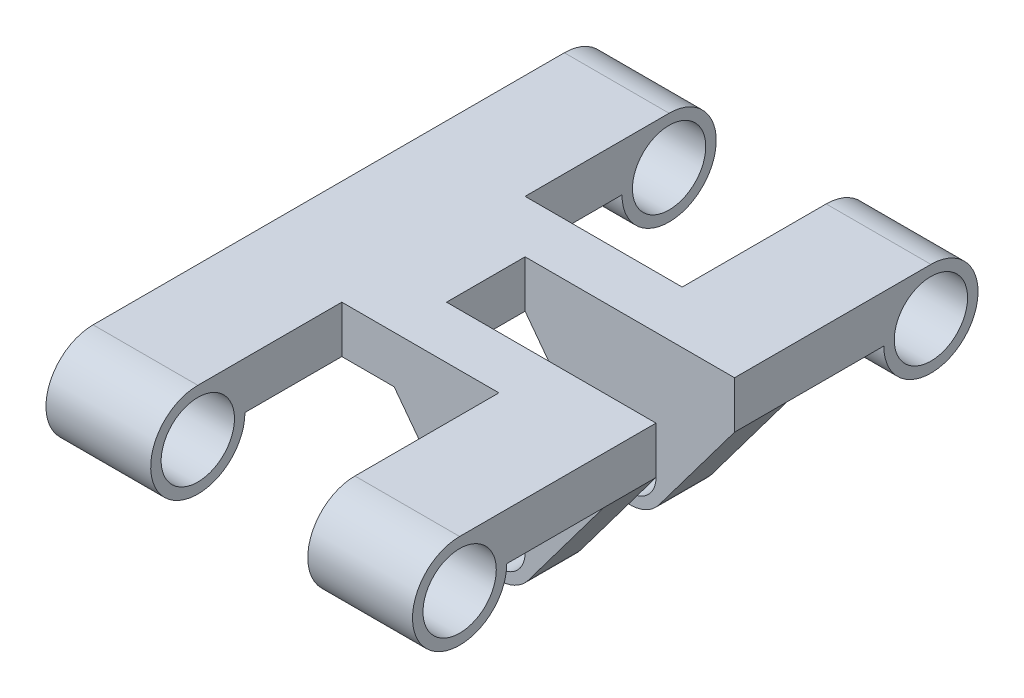
ISO-10303-21;
HEADER;
FILE_DESCRIPTION(('STEP AP214'),'2;1');
FILE_NAME('part.step','',(''),(''),'','','');
FILE_SCHEMA(('AUTOMOTIVE_DESIGN { 1 0 10303 214 1 1 1 1 }'));
ENDSEC;
DATA;
#1=APPLICATION_CONTEXT('core data for automotive mechanical design processes');
#2=APPLICATION_PROTOCOL_DEFINITION('international standard','automotive_design',2000,#1);
#3=PRODUCT_CONTEXT('',#1,'mechanical');
#4=PRODUCT('Part','Part','',(#3));
#5=PRODUCT_RELATED_PRODUCT_CATEGORY('part','',(#4));
#6=PRODUCT_DEFINITION_FORMATION('','',#4);
#7=PRODUCT_DEFINITION_CONTEXT('part definition',#1,'design');
#8=PRODUCT_DEFINITION('design','',#6,#7);
#9=PRODUCT_DEFINITION_SHAPE('','',#8);
#10=(LENGTH_UNIT() NAMED_UNIT(*) SI_UNIT(.MILLI.,.METRE.));
#11=(NAMED_UNIT(*) PLANE_ANGLE_UNIT() SI_UNIT($,.RADIAN.));
#12=(NAMED_UNIT(*) SI_UNIT($,.STERADIAN.) SOLID_ANGLE_UNIT());
#13=UNCERTAINTY_MEASURE_WITH_UNIT(LENGTH_MEASURE(1.E-05),#10,'distance_accuracy_value','');
#14=(GEOMETRIC_REPRESENTATION_CONTEXT(3) GLOBAL_UNCERTAINTY_ASSIGNED_CONTEXT((#13)) GLOBAL_UNIT_ASSIGNED_CONTEXT((#10,
#11,#12)) REPRESENTATION_CONTEXT('',''));
#15=CARTESIAN_POINT('',(0.,0.,0.));
#16=DIRECTION('',(0.,0.,1.));
#17=DIRECTION('',(1.,0.,0.));
#18=AXIS2_PLACEMENT_3D('',#15,#16,#17);
#19=CARTESIAN_POINT('',(-20.,0.,0.));
#20=DIRECTION('',(0.,-1.,0.));
#21=DIRECTION('',(0.,0.,-1.));
#22=AXIS2_PLACEMENT_3D('',#19,#20,#21);
#23=PLANE('',#22);
#24=DIRECTION('',(0.,0.,-1.));
#25=VECTOR('',#24,1.);
#26=CARTESIAN_POINT('',(10.,0.,-52.5));
#27=LINE('',#26,#25);
#28=CARTESIAN_POINT('',(10.,0.,-37.4999999999999));
#29=VERTEX_POINT('',#28);
#30=CARTESIAN_POINT('',(10.,0.,-52.5));
#31=VERTEX_POINT('',#30);
#32=EDGE_CURVE('E257',#29,#31,#27,.T.);
#33=ORIENTED_EDGE('',*,*,#32,.F.);
#34=DIRECTION('',(0.,0.,-1.));
#35=VECTOR('',#34,1.);
#36=CARTESIAN_POINT('',(10.,0.,18.1508488420533));
#37=LINE('',#36,#35);
#38=CARTESIAN_POINT('',(10.,0.,-27.5));
#39=VERTEX_POINT('',#38);
#40=EDGE_CURVE('E384',#39,#29,#37,.T.);
#41=ORIENTED_EDGE('',*,*,#40,.F.);
#42=DIRECTION('',(1.,0.,0.));
#43=VECTOR('',#42,1.);
#44=CARTESIAN_POINT('',(50.,0.,-27.5));
#45=LINE('',#44,#43);
#46=CARTESIAN_POINT('',(0.,0.,-27.5));
#47=VERTEX_POINT('',#46);
#48=EDGE_CURVE('E246',#47,#39,#45,.T.);
#49=ORIENTED_EDGE('',*,*,#48,.F.);
#50=DIRECTION('',(0.,0.,-1.));
#51=VECTOR('',#50,1.);
#52=CARTESIAN_POINT('',(0.,0.,0.));
#53=LINE('',#52,#51);
#54=CARTESIAN_POINT('',(0.,0.,-9.));
#55=VERTEX_POINT('',#54);
#56=EDGE_CURVE('E304',#55,#47,#53,.T.);
#57=ORIENTED_EDGE('',*,*,#56,.F.);
#58=DIRECTION('',(1.,0.,0.));
#59=VECTOR('',#58,1.);
#60=CARTESIAN_POINT('',(-20.,0.,-9.));
#61=LINE('',#60,#59);
#62=CARTESIAN_POINT('',(-20.,0.,-9.));
#63=VERTEX_POINT('',#62);
#64=EDGE_CURVE('E64',#63,#55,#61,.T.);
#65=ORIENTED_EDGE('',*,*,#64,.F.);
#66=DIRECTION('',(0.,0.,-1.));
#67=VECTOR('',#66,1.);
#68=CARTESIAN_POINT('',(-20.,0.,0.));
#69=LINE('',#68,#67);
#70=CARTESIAN_POINT('',(-20.,0.,-81.));
#71=VERTEX_POINT('',#70);
#72=EDGE_CURVE('E279',#63,#71,#69,.T.);
#73=ORIENTED_EDGE('',*,*,#72,.T.);
#74=DIRECTION('',(1.,0.,0.));
#75=VECTOR('',#74,1.);
#76=CARTESIAN_POINT('',(-20.,0.,-81.));
#77=LINE('',#76,#75);
#78=CARTESIAN_POINT('',(0.,0.,-81.));
#79=VERTEX_POINT('',#78);
#80=EDGE_CURVE('E303',#71,#79,#77,.T.);
#81=ORIENTED_EDGE('',*,*,#80,.T.);
#82=CARTESIAN_POINT('',(0.,0.,-62.5));
#83=VERTEX_POINT('',#82);
#84=EDGE_CURVE('E278',#83,#79,#53,.T.);
#85=ORIENTED_EDGE('',*,*,#84,.F.);
#86=DIRECTION('',(-1.,0.,0.));
#87=VECTOR('',#86,1.);
#88=CARTESIAN_POINT('',(0.,0.,-62.5));
#89=LINE('',#88,#87);
#90=CARTESIAN_POINT('',(10.,0.,-62.5));
#91=VERTEX_POINT('',#90);
#92=EDGE_CURVE('E264',#91,#83,#89,.T.);
#93=ORIENTED_EDGE('',*,*,#92,.F.);
#94=DIRECTION('',(0.,0.,1.));
#95=VECTOR('',#94,1.);
#96=CARTESIAN_POINT('',(10.,0.,-108.150848842053));
#97=LINE('',#96,#95);
#98=EDGE_CURVE('E386',#91,#31,#97,.T.);
#99=ORIENTED_EDGE('',*,*,#98,.T.);
#100=EDGE_LOOP('',(#33,#41,#49,#57,#65,#73,#81,#85,#93,#99));
#101=FACE_BOUND('',#100,.T.);
#102=ADVANCED_FACE('F55',(#101),#23,.T.);
#103=DIRECTION('',(-1.,0.,0.));
#104=VECTOR('',#103,1.);
#105=CARTESIAN_POINT('',(10.,0.,-27.5));
#106=LINE('',#105,#104);
#107=CARTESIAN_POINT('',(50.,0.,-27.5));
#108=VERTEX_POINT('',#107);
#109=CARTESIAN_POINT('',(29.9999999999999,0.,-27.5));
#110=VERTEX_POINT('',#109);
#111=EDGE_CURVE('E222',#108,#110,#106,.T.);
#112=ORIENTED_EDGE('',*,*,#111,.F.);
#113=DIRECTION('',(0.,0.,-1.));
#114=VECTOR('',#113,1.);
#115=CARTESIAN_POINT('',(50.,0.,-37.5));
#116=LINE('',#115,#114);
#117=CARTESIAN_POINT('',(50.,0.,-9.00000000000004));
#118=VERTEX_POINT('',#117);
#119=EDGE_CURVE('E231',#118,#108,#116,.T.);
#120=ORIENTED_EDGE('',*,*,#119,.F.);
#121=DIRECTION('',(1.,0.,0.));
#122=VECTOR('',#121,1.);
#123=CARTESIAN_POINT('',(30.,0.,-8.99999999999999));
#124=LINE('',#123,#122);
#125=CARTESIAN_POINT('',(30.,0.,-8.99999999999999));
#126=VERTEX_POINT('',#125);
#127=EDGE_CURVE('E431',#126,#118,#124,.T.);
#128=ORIENTED_EDGE('',*,*,#127,.F.);
#129=DIRECTION('',(0.,0.,-1.));
#130=VECTOR('',#129,1.);
#131=CARTESIAN_POINT('',(30.,0.,0.));
#132=LINE('',#131,#130);
#133=EDGE_CURVE('E234',#126,#110,#132,.T.);
#134=ORIENTED_EDGE('',*,*,#133,.T.);
#135=EDGE_LOOP('',(#112,#120,#128,#134));
#136=FACE_BOUND('',#135,.T.);
#137=ADVANCED_FACE('F230',(#136),#23,.T.);
#138=CARTESIAN_POINT('',(0.,-61.0327780786685,-62.5));
#139=DIRECTION('',(0.,0.,-1.));
#140=DIRECTION('',(-1.,0.,0.));
#141=AXIS2_PLACEMENT_3D('',#138,#139,#140);
#142=PLANE('',#141);
#143=DIRECTION('',(-1.,0.,0.));
#144=VECTOR('',#143,1.);
#145=CARTESIAN_POINT('',(0.,9.,-62.5));
#146=LINE('',#145,#144);
#147=CARTESIAN_POINT('',(29.9999999999998,9.,-62.5));
#148=VERTEX_POINT('',#147);
#149=CARTESIAN_POINT('',(0.,9.,-62.5));
#150=VERTEX_POINT('',#149);
#151=EDGE_CURVE('E253',#148,#150,#146,.T.);
#152=ORIENTED_EDGE('',*,*,#151,.F.);
#153=DIRECTION('',(0.,-1.,0.));
#154=VECTOR('',#153,1.);
#155=CARTESIAN_POINT('',(29.9999999999998,-61.0327780786685,-62.5));
#156=LINE('',#155,#154);
#157=CARTESIAN_POINT('',(29.9999999999998,0.,-62.5));
#158=VERTEX_POINT('',#157);
#159=EDGE_CURVE('E13',#148,#158,#156,.T.);
#160=ORIENTED_EDGE('',*,*,#159,.T.);
#161=DIRECTION('',(-1.,0.,0.));
#162=VECTOR('',#161,1.);
#163=CARTESIAN_POINT('',(10.,0.,-62.5));
#164=LINE('',#163,#162);
#165=CARTESIAN_POINT('',(50.,0.,-62.5));
#166=VERTEX_POINT('',#165);
#167=EDGE_CURVE('E390',#166,#158,#164,.T.);
#168=ORIENTED_EDGE('',*,*,#167,.F.);
#169=DIRECTION('',(0.6,0.8,0.));
#170=VECTOR('',#169,1.);
#171=CARTESIAN_POINT('',(50.,0.,-62.5));
#172=LINE('',#171,#170);
#173=CARTESIAN_POINT('',(35.6,-19.2,-62.5));
#174=VERTEX_POINT('',#173);
#175=EDGE_CURVE('E71',#174,#166,#172,.T.);
#176=ORIENTED_EDGE('',*,*,#175,.F.);
#177=CARTESIAN_POINT('',(30.,-15.,-62.5));
#178=DIRECTION('',(0.,0.,-1.));
#179=DIRECTION('',(-1.,0.,0.));
#180=AXIS2_PLACEMENT_3D('',#177,#178,#179);
#181=CIRCLE('',#180,7.);
#182=CARTESIAN_POINT('',(24.4,-19.2,-62.5));
#183=VERTEX_POINT('',#182);
#184=EDGE_CURVE('E566',#183,#174,#181,.F.);
#185=ORIENTED_EDGE('',*,*,#184,.F.);
#186=DIRECTION('',(0.6,-0.8,0.));
#187=VECTOR('',#186,1.);
#188=CARTESIAN_POINT('',(10.,0.,-62.5));
#189=LINE('',#188,#187);
#190=EDGE_CURVE('E562',#91,#183,#189,.T.);
#191=ORIENTED_EDGE('',*,*,#190,.F.);
#192=ORIENTED_EDGE('',*,*,#92,.T.);
#193=DIRECTION('',(0.,1.,0.));
#194=VECTOR('',#193,1.);
#195=CARTESIAN_POINT('',(0.,-61.0327780786685,-62.5));
#196=LINE('',#195,#194);
#197=EDGE_CURVE('E259',#83,#150,#196,.T.);
#198=ORIENTED_EDGE('',*,*,#197,.T.);
#199=EDGE_LOOP('',(#152,#160,#168,#176,#185,#191,#192,#198));
#200=FACE_BOUND('',#199,.T.);
#201=CARTESIAN_POINT('',(30.,-15.,-62.5));
#202=DIRECTION('',(0.,0.,-1.));
#203=DIRECTION('',(-1.,0.,0.));
#204=AXIS2_PLACEMENT_3D('',#201,#202,#203);
#205=CIRCLE('',#204,4.99999999999999);
#206=CARTESIAN_POINT('',(25.,-15.,-62.5));
#207=VERTEX_POINT('',#206);
#208=EDGE_CURVE('E467',#207,#207,#205,.F.);
#209=ORIENTED_EDGE('',*,*,#208,.T.);
#210=EDGE_LOOP('',(#209));
#211=FACE_BOUND('',#210,.T.);
#212=ADVANCED_FACE('F528',(#200,#211),#142,.T.);
#213=CARTESIAN_POINT('',(50.,-61.0327780786685,-27.5));
#214=DIRECTION('',(0.,0.,1.));
#215=DIRECTION('',(1.,0.,0.));
#216=AXIS2_PLACEMENT_3D('',#213,#214,#215);
#217=PLANE('',#216);
#218=ORIENTED_EDGE('',*,*,#48,.T.);
#219=DIRECTION('',(0.6,-0.8,0.));
#220=VECTOR('',#219,1.);
#221=CARTESIAN_POINT('',(10.,0.,-27.5));
#222=LINE('',#221,#220);
#223=CARTESIAN_POINT('',(24.4,-19.2,-27.5));
#224=VERTEX_POINT('',#223);
#225=EDGE_CURVE('E237',#39,#224,#222,.T.);
#226=ORIENTED_EDGE('',*,*,#225,.T.);
#227=CARTESIAN_POINT('',(30.,-15.,-27.5));
#228=DIRECTION('',(0.,0.,1.));
#229=DIRECTION('',(1.,0.,0.));
#230=AXIS2_PLACEMENT_3D('',#227,#228,#229);
#231=CIRCLE('',#230,7.);
#232=CARTESIAN_POINT('',(35.6,-19.2,-27.5));
#233=VERTEX_POINT('',#232);
#234=EDGE_CURVE('E224',#224,#233,#231,.T.);
#235=ORIENTED_EDGE('',*,*,#234,.T.);
#236=DIRECTION('',(0.6,0.8,0.));
#237=VECTOR('',#236,1.);
#238=CARTESIAN_POINT('',(50.,0.,-27.5));
#239=LINE('',#238,#237);
#240=EDGE_CURVE('E208',#233,#108,#239,.T.);
#241=ORIENTED_EDGE('',*,*,#240,.T.);
#242=ORIENTED_EDGE('',*,*,#111,.T.);
#243=DIRECTION('',(0.,-1.,0.));
#244=VECTOR('',#243,1.);
#245=CARTESIAN_POINT('',(29.9999999999999,0.,-27.4999999999999));
#246=LINE('',#245,#244);
#247=CARTESIAN_POINT('',(29.9999999999999,9.,-27.5));
#248=VERTEX_POINT('',#247);
#249=EDGE_CURVE('E79',#248,#110,#246,.T.);
#250=ORIENTED_EDGE('',*,*,#249,.F.);
#251=DIRECTION('',(1.,0.,0.));
#252=VECTOR('',#251,1.);
#253=CARTESIAN_POINT('',(50.,9.,-27.5));
#254=LINE('',#253,#252);
#255=CARTESIAN_POINT('',(0.,9.,-27.5));
#256=VERTEX_POINT('',#255);
#257=EDGE_CURVE('E423',#256,#248,#254,.T.);
#258=ORIENTED_EDGE('',*,*,#257,.F.);
#259=DIRECTION('',(0.,1.,0.));
#260=VECTOR('',#259,1.);
#261=CARTESIAN_POINT('',(0.,-61.0327780786685,-27.5));
#262=LINE('',#261,#260);
#263=EDGE_CURVE('E263',#47,#256,#262,.T.);
#264=ORIENTED_EDGE('',*,*,#263,.F.);
#265=EDGE_LOOP('',(#218,#226,#235,#241,#242,#250,#258,#264));
#266=FACE_BOUND('',#265,.T.);
#267=CARTESIAN_POINT('',(30.,-15.,-27.5));
#268=DIRECTION('',(0.,0.,1.));
#269=DIRECTION('',(1.,0.,0.));
#270=AXIS2_PLACEMENT_3D('',#267,#268,#269);
#271=CIRCLE('',#270,4.99999999999999);
#272=CARTESIAN_POINT('',(35.,-15.,-27.5));
#273=VERTEX_POINT('',#272);
#274=EDGE_CURVE('E226',#273,#273,#271,.T.);
#275=ORIENTED_EDGE('',*,*,#274,.F.);
#276=EDGE_LOOP('',(#275));
#277=FACE_BOUND('',#276,.T.);
#278=ADVANCED_FACE('F220',(#266,#277),#217,.T.);
#279=CARTESIAN_POINT('',(0.,0.,0.));
#280=DIRECTION('',(1.,0.,0.));
#281=DIRECTION('',(0.,0.,-1.));
#282=AXIS2_PLACEMENT_3D('',#279,#280,#281);
#283=PLANE('',#282);
#284=CARTESIAN_POINT('',(0.,0.,0.));
#285=DIRECTION('',(1.,0.,0.));
#286=DIRECTION('',(0.,0.,-1.));
#287=AXIS2_PLACEMENT_3D('',#284,#285,#286);
#288=CIRCLE('',#287,7.);
#289=CARTESIAN_POINT('',(0.,0.,-7.));
#290=VERTEX_POINT('',#289);
#291=EDGE_CURVE('E321',#290,#290,#288,.T.);
#292=ORIENTED_EDGE('',*,*,#291,.F.);
#293=EDGE_LOOP('',(#292));
#294=FACE_BOUND('',#293,.T.);
#295=ORIENTED_EDGE('',*,*,#56,.T.);
#296=ORIENTED_EDGE('',*,*,#263,.T.);
#297=DIRECTION('',(0.,0.,-1.));
#298=VECTOR('',#297,1.);
#299=CARTESIAN_POINT('',(0.,9.,0.));
#300=LINE('',#299,#298);
#301=CARTESIAN_POINT('',(0.,9.,0.));
#302=VERTEX_POINT('',#301);
#303=EDGE_CURVE('E313',#302,#256,#300,.T.);
#304=ORIENTED_EDGE('',*,*,#303,.F.);
#305=CARTESIAN_POINT('',(0.,0.,0.));
#306=DIRECTION('',(1.,0.,0.));
#307=DIRECTION('',(0.,0.,-1.));
#308=AXIS2_PLACEMENT_3D('',#305,#306,#307);
#309=CIRCLE('',#308,9.);
#310=EDGE_CURVE('E317',#302,#55,#309,.T.);
#311=ORIENTED_EDGE('',*,*,#310,.T.);
#312=EDGE_LOOP('',(#295,#296,#304,#311));
#313=FACE_BOUND('',#312,.T.);
#314=ADVANCED_FACE('F522',(#294,#313),#283,.T.);
#315=ORIENTED_EDGE('',*,*,#167,.T.);
#316=DIRECTION('',(0.,0.,-1.));
#317=VECTOR('',#316,1.);
#318=CARTESIAN_POINT('',(30.,0.,0.));
#319=LINE('',#318,#317);
#320=CARTESIAN_POINT('',(29.9999999999998,0.,-81.0000000000001));
#321=VERTEX_POINT('',#320);
#322=EDGE_CURVE('E473',#158,#321,#319,.T.);
#323=ORIENTED_EDGE('',*,*,#322,.T.);
#324=DIRECTION('',(1.,0.,0.));
#325=VECTOR('',#324,1.);
#326=CARTESIAN_POINT('',(29.9999999999998,0.,-81.0000000000001));
#327=LINE('',#326,#325);
#328=CARTESIAN_POINT('',(49.9999999999998,0.,-81.0000000000001));
#329=VERTEX_POINT('',#328);
#330=EDGE_CURVE('E459',#321,#329,#327,.T.);
#331=ORIENTED_EDGE('',*,*,#330,.T.);
#332=DIRECTION('',(0.,0.,-1.));
#333=VECTOR('',#332,1.);
#334=CARTESIAN_POINT('',(50.,0.,-62.5));
#335=LINE('',#334,#333);
#336=EDGE_CURVE('E269',#166,#329,#335,.T.);
#337=ORIENTED_EDGE('',*,*,#336,.F.);
#338=EDGE_LOOP('',(#315,#323,#331,#337));
#339=FACE_BOUND('',#338,.T.);
#340=ADVANCED_FACE('F57',(#339),#23,.T.);
#341=CARTESIAN_POINT('',(-20.,0.,0.));
#342=DIRECTION('',(1.,0.,0.));
#343=DIRECTION('',(0.,0.,-1.));
#344=AXIS2_PLACEMENT_3D('',#341,#342,#343);
#345=CYLINDRICAL_SURFACE('',#344,9.);
#346=ORIENTED_EDGE('',*,*,#310,.F.);
#347=DIRECTION('',(1.,0.,0.));
#348=VECTOR('',#347,1.);
#349=CARTESIAN_POINT('',(-20.,9.,0.));
#350=LINE('',#349,#348);
#351=CARTESIAN_POINT('',(-20.,9.,0.));
#352=VERTEX_POINT('',#351);
#353=EDGE_CURVE('E330',#352,#302,#350,.T.);
#354=ORIENTED_EDGE('',*,*,#353,.F.);
#355=CARTESIAN_POINT('',(-20.,0.,0.));
#356=DIRECTION('',(1.,0.,0.));
#357=DIRECTION('',(0.,0.,-1.));
#358=AXIS2_PLACEMENT_3D('',#355,#356,#357);
#359=CIRCLE('',#358,9.);
#360=EDGE_CURVE('E291',#352,#63,#359,.T.);
#361=ORIENTED_EDGE('',*,*,#360,.T.);
#362=ORIENTED_EDGE('',*,*,#64,.T.);
#363=EDGE_LOOP('',(#346,#354,#361,#362));
#364=FACE_BOUND('',#363,.T.);
#365=ADVANCED_FACE('F530',(#364),#345,.T.);
#366=CARTESIAN_POINT('',(-20.,9.,0.));
#367=DIRECTION('',(0.,-1.,0.));
#368=DIRECTION('',(0.,0.,-1.));
#369=AXIS2_PLACEMENT_3D('',#366,#367,#368);
#370=PLANE('',#369);
#371=DIRECTION('',(0.,0.,-1.));
#372=VECTOR('',#371,1.);
#373=CARTESIAN_POINT('',(50.,9.,-62.5));
#374=LINE('',#373,#372);
#375=CARTESIAN_POINT('',(50.,9.,-52.5));
#376=VERTEX_POINT('',#375);
#377=CARTESIAN_POINT('',(49.9999999999998,9.,-90.));
#378=VERTEX_POINT('',#377);
#379=EDGE_CURVE('E405',#376,#378,#374,.T.);
#380=ORIENTED_EDGE('',*,*,#379,.T.);
#381=DIRECTION('',(1.,0.,0.));
#382=VECTOR('',#381,1.);
#383=CARTESIAN_POINT('',(29.9999999999998,9.,-89.9999999999999));
#384=LINE('',#383,#382);
#385=CARTESIAN_POINT('',(29.9999999999998,9.,-89.9999999999999));
#386=VERTEX_POINT('',#385);
#387=EDGE_CURVE('E446',#386,#378,#384,.T.);
#388=ORIENTED_EDGE('',*,*,#387,.F.);
#389=DIRECTION('',(0.,0.,-1.));
#390=VECTOR('',#389,1.);
#391=CARTESIAN_POINT('',(30.,9.,0.));
#392=LINE('',#391,#390);
#393=EDGE_CURVE('E550',#148,#386,#392,.T.);
#394=ORIENTED_EDGE('',*,*,#393,.F.);
#395=ORIENTED_EDGE('',*,*,#151,.T.);
#396=CARTESIAN_POINT('',(0.,9.,-90.));
#397=VERTEX_POINT('',#396);
#398=EDGE_CURVE('E312',#150,#397,#300,.T.);
#399=ORIENTED_EDGE('',*,*,#398,.T.);
#400=DIRECTION('',(1.,0.,0.));
#401=VECTOR('',#400,1.);
#402=CARTESIAN_POINT('',(-20.,9.,-90.));
#403=LINE('',#402,#401);
#404=CARTESIAN_POINT('',(-20.,9.,-90.));
#405=VERTEX_POINT('',#404);
#406=EDGE_CURVE('E333',#405,#397,#403,.T.);
#407=ORIENTED_EDGE('',*,*,#406,.F.);
#408=DIRECTION('',(0.,0.,-1.));
#409=VECTOR('',#408,1.);
#410=CARTESIAN_POINT('',(-20.,9.,0.));
#411=LINE('',#410,#409);
#412=EDGE_CURVE('E288',#352,#405,#411,.T.);
#413=ORIENTED_EDGE('',*,*,#412,.F.);
#414=ORIENTED_EDGE('',*,*,#353,.T.);
#415=ORIENTED_EDGE('',*,*,#303,.T.);
#416=ORIENTED_EDGE('',*,*,#257,.T.);
#417=DIRECTION('',(0.,0.,-1.));
#418=VECTOR('',#417,1.);
#419=CARTESIAN_POINT('',(30.,9.,0.));
#420=LINE('',#419,#418);
#421=CARTESIAN_POINT('',(30.,9.,0.));
#422=VERTEX_POINT('',#421);
#423=EDGE_CURVE('E435',#422,#248,#420,.T.);
#424=ORIENTED_EDGE('',*,*,#423,.F.);
#425=DIRECTION('',(1.,0.,0.));
#426=VECTOR('',#425,1.);
#427=CARTESIAN_POINT('',(30.,9.,0.));
#428=LINE('',#427,#426);
#429=CARTESIAN_POINT('',(50.,9.,0.));
#430=VERTEX_POINT('',#429);
#431=EDGE_CURVE('E425',#422,#430,#428,.T.);
#432=ORIENTED_EDGE('',*,*,#431,.T.);
#433=DIRECTION('',(0.,0.,-1.));
#434=VECTOR('',#433,1.);
#435=CARTESIAN_POINT('',(50.,9.,-37.5));
#436=LINE('',#435,#434);
#437=CARTESIAN_POINT('',(50.,9.,-37.5));
#438=VERTEX_POINT('',#437);
#439=EDGE_CURVE('E417',#430,#438,#436,.T.);
#440=ORIENTED_EDGE('',*,*,#439,.T.);
#441=DIRECTION('',(-1.,0.,0.));
#442=VECTOR('',#441,1.);
#443=CARTESIAN_POINT('',(10.,9.,-37.4999999999999));
#444=LINE('',#443,#442);
#445=CARTESIAN_POINT('',(10.,9.,-37.4999999999999));
#446=VERTEX_POINT('',#445);
#447=EDGE_CURVE('E412',#438,#446,#444,.T.);
#448=ORIENTED_EDGE('',*,*,#447,.T.);
#449=DIRECTION('',(0.,0.,-1.));
#450=VECTOR('',#449,1.);
#451=CARTESIAN_POINT('',(10.,9.,-52.5));
#452=LINE('',#451,#450);
#453=CARTESIAN_POINT('',(10.,9.,-52.5));
#454=VERTEX_POINT('',#453);
#455=EDGE_CURVE('E406',#446,#454,#452,.T.);
#456=ORIENTED_EDGE('',*,*,#455,.T.);
#457=DIRECTION('',(1.,0.,0.));
#458=VECTOR('',#457,1.);
#459=CARTESIAN_POINT('',(50.,9.,-52.5));
#460=LINE('',#459,#458);
#461=EDGE_CURVE('E398',#454,#376,#460,.T.);
#462=ORIENTED_EDGE('',*,*,#461,.T.);
#463=EDGE_LOOP('',(#380,#388,#394,#395,#399,#407,#413,#414,#415,#416,#424,#432,#440,#448,#456,#462));
#464=FACE_BOUND('',#463,.T.);
#465=ADVANCED_FACE('F409',(#464),#370,.F.);
#466=CARTESIAN_POINT('',(-20.,0.,0.));
#467=DIRECTION('',(1.,0.,0.));
#468=DIRECTION('',(0.,0.,-1.));
#469=AXIS2_PLACEMENT_3D('',#466,#467,#468);
#470=CYLINDRICAL_SURFACE('',#469,7.);
#471=CARTESIAN_POINT('',(-20.,0.,0.));
#472=DIRECTION('',(1.,0.,0.));
#473=DIRECTION('',(0.,0.,-1.));
#474=AXIS2_PLACEMENT_3D('',#471,#472,#473);
#475=CIRCLE('',#474,7.);
#476=CARTESIAN_POINT('',(-20.,0.,-7.));
#477=VERTEX_POINT('',#476);
#478=EDGE_CURVE('E295',#477,#477,#475,.T.);
#479=ORIENTED_EDGE('',*,*,#478,.F.);
#480=EDGE_LOOP('',(#479));
#481=FACE_BOUND('',#480,.T.);
#482=ORIENTED_EDGE('',*,*,#291,.T.);
#483=EDGE_LOOP('',(#482));
#484=FACE_BOUND('',#483,.T.);
#485=ADVANCED_FACE('F663',(#481,#484),#470,.F.);
#486=CARTESIAN_POINT('',(-20.,0.,-90.));
#487=DIRECTION('',(1.,0.,0.));
#488=DIRECTION('',(0.,0.,-1.));
#489=AXIS2_PLACEMENT_3D('',#486,#487,#488);
#490=CYLINDRICAL_SURFACE('',#489,9.);
#491=CARTESIAN_POINT('',(0.,0.,-90.));
#492=DIRECTION('',(1.,0.,0.));
#493=DIRECTION('',(0.,0.,-1.));
#494=AXIS2_PLACEMENT_3D('',#491,#492,#493);
#495=CIRCLE('',#494,9.);
#496=EDGE_CURVE('E308',#79,#397,#495,.T.);
#497=ORIENTED_EDGE('',*,*,#496,.F.);
#498=ORIENTED_EDGE('',*,*,#80,.F.);
#499=CARTESIAN_POINT('',(-20.,0.,-90.));
#500=DIRECTION('',(1.,0.,0.));
#501=DIRECTION('',(0.,0.,-1.));
#502=AXIS2_PLACEMENT_3D('',#499,#500,#501);
#503=CIRCLE('',#502,9.);
#504=EDGE_CURVE('E283',#71,#405,#503,.T.);
#505=ORIENTED_EDGE('',*,*,#504,.T.);
#506=ORIENTED_EDGE('',*,*,#406,.T.);
#507=EDGE_LOOP('',(#497,#498,#505,#506));
#508=FACE_BOUND('',#507,.T.);
#509=ADVANCED_FACE('F347',(#508),#490,.T.);
#510=CARTESIAN_POINT('',(-20.,0.,-90.));
#511=DIRECTION('',(1.,0.,0.));
#512=DIRECTION('',(0.,0.,-1.));
#513=AXIS2_PLACEMENT_3D('',#510,#511,#512);
#514=CYLINDRICAL_SURFACE('',#513,7.);
#515=CARTESIAN_POINT('',(-20.,0.,-90.));
#516=DIRECTION('',(1.,0.,0.));
#517=DIRECTION('',(0.,0.,-1.));
#518=AXIS2_PLACEMENT_3D('',#515,#516,#517);
#519=CIRCLE('',#518,7.);
#520=CARTESIAN_POINT('',(-20.,0.,-97.));
#521=VERTEX_POINT('',#520);
#522=EDGE_CURVE('E299',#521,#521,#519,.T.);
#523=ORIENTED_EDGE('',*,*,#522,.F.);
#524=EDGE_LOOP('',(#523));
#525=FACE_BOUND('',#524,.T.);
#526=CARTESIAN_POINT('',(0.,0.,-90.));
#527=DIRECTION('',(1.,0.,0.));
#528=DIRECTION('',(0.,0.,-1.));
#529=AXIS2_PLACEMENT_3D('',#526,#527,#528);
#530=CIRCLE('',#529,7.);
#531=CARTESIAN_POINT('',(0.,0.,-97.));
#532=VERTEX_POINT('',#531);
#533=EDGE_CURVE('E284',#532,#532,#530,.T.);
#534=ORIENTED_EDGE('',*,*,#533,.T.);
#535=EDGE_LOOP('',(#534));
#536=FACE_BOUND('',#535,.T.);
#537=ADVANCED_FACE('F657',(#525,#536),#514,.F.);
#538=CARTESIAN_POINT('',(-20.,0.,0.));
#539=DIRECTION('',(1.,0.,0.));
#540=DIRECTION('',(0.,0.,-1.));
#541=AXIS2_PLACEMENT_3D('',#538,#539,#540);
#542=PLANE('',#541);
#543=ORIENTED_EDGE('',*,*,#72,.F.);
#544=ORIENTED_EDGE('',*,*,#360,.F.);
#545=ORIENTED_EDGE('',*,*,#412,.T.);
#546=ORIENTED_EDGE('',*,*,#504,.F.);
#547=EDGE_LOOP('',(#543,#544,#545,#546));
#548=FACE_BOUND('',#547,.T.);
#549=ORIENTED_EDGE('',*,*,#478,.T.);
#550=EDGE_LOOP('',(#549));
#551=FACE_BOUND('',#550,.T.);
#552=ORIENTED_EDGE('',*,*,#522,.T.);
#553=EDGE_LOOP('',(#552));
#554=FACE_BOUND('',#553,.T.);
#555=ADVANCED_FACE('F520',(#548,#551,#554),#542,.F.);
#556=ORIENTED_EDGE('',*,*,#197,.F.);
#557=ORIENTED_EDGE('',*,*,#84,.T.);
#558=ORIENTED_EDGE('',*,*,#496,.T.);
#559=ORIENTED_EDGE('',*,*,#398,.F.);
#560=EDGE_LOOP('',(#556,#557,#558,#559));
#561=FACE_BOUND('',#560,.T.);
#562=ORIENTED_EDGE('',*,*,#533,.F.);
#563=EDGE_LOOP('',(#562));
#564=FACE_BOUND('',#563,.T.);
#565=ADVANCED_FACE('F352',(#561,#564),#283,.T.);
#566=CARTESIAN_POINT('',(50.,-61.0327780786685,-37.5));
#567=DIRECTION('',(1.,0.,0.));
#568=DIRECTION('',(0.,0.,-1.));
#569=AXIS2_PLACEMENT_3D('',#566,#567,#568);
#570=PLANE('',#569);
#571=ORIENTED_EDGE('',*,*,#439,.F.);
#572=CARTESIAN_POINT('',(50.,0.,0.));
#573=DIRECTION('',(1.,0.,0.));
#574=DIRECTION('',(0.,0.,-1.));
#575=AXIS2_PLACEMENT_3D('',#572,#573,#574);
#576=CIRCLE('',#575,9.);
#577=EDGE_CURVE('E243',#430,#118,#576,.T.);
#578=ORIENTED_EDGE('',*,*,#577,.T.);
#579=ORIENTED_EDGE('',*,*,#119,.T.);
#580=DIRECTION('',(0.,0.,-1.));
#581=VECTOR('',#580,1.);
#582=CARTESIAN_POINT('',(50.,0.,18.1508488420533));
#583=LINE('',#582,#581);
#584=CARTESIAN_POINT('',(50.,0.,-37.5));
#585=VERTEX_POINT('',#584);
#586=EDGE_CURVE('E205',#108,#585,#583,.T.);
#587=ORIENTED_EDGE('',*,*,#586,.T.);
#588=DIRECTION('',(0.,1.,0.));
#589=VECTOR('',#588,1.);
#590=CARTESIAN_POINT('',(50.,-61.0327780786685,-37.5));
#591=LINE('',#590,#589);
#592=EDGE_CURVE('E245',#585,#438,#591,.T.);
#593=ORIENTED_EDGE('',*,*,#592,.T.);
#594=EDGE_LOOP('',(#571,#578,#579,#587,#593));
#595=FACE_BOUND('',#594,.T.);
#596=CARTESIAN_POINT('',(50.,0.,0.));
#597=DIRECTION('',(1.,0.,0.));
#598=DIRECTION('',(0.,0.,-1.));
#599=AXIS2_PLACEMENT_3D('',#596,#597,#598);
#600=CIRCLE('',#599,7.);
#601=CARTESIAN_POINT('',(50.,0.,-6.99999999999997));
#602=VERTEX_POINT('',#601);
#603=EDGE_CURVE('E458',#602,#602,#600,.T.);
#604=ORIENTED_EDGE('',*,*,#603,.F.);
#605=EDGE_LOOP('',(#604));
#606=FACE_BOUND('',#605,.T.);
#607=ADVANCED_FACE('F240',(#595,#606),#570,.T.);
#608=CARTESIAN_POINT('',(10.,-61.0327780786685,-37.4999999999999));
#609=DIRECTION('',(0.,0.,-1.));
#610=DIRECTION('',(-1.,0.,0.));
#611=AXIS2_PLACEMENT_3D('',#608,#609,#610);
#612=PLANE('',#611);
#613=ORIENTED_EDGE('',*,*,#592,.F.);
#614=DIRECTION('',(0.6,0.8,0.));
#615=VECTOR('',#614,1.);
#616=CARTESIAN_POINT('',(50.,0.,-37.5));
#617=LINE('',#616,#615);
#618=CARTESIAN_POINT('',(35.6,-19.2,-37.5));
#619=VERTEX_POINT('',#618);
#620=EDGE_CURVE('E211',#619,#585,#617,.T.);
#621=ORIENTED_EDGE('',*,*,#620,.F.);
#622=CARTESIAN_POINT('',(30.,-15.,-37.5));
#623=DIRECTION('',(0.,0.,1.));
#624=DIRECTION('',(1.,0.,0.));
#625=AXIS2_PLACEMENT_3D('',#622,#623,#624);
#626=CIRCLE('',#625,7.);
#627=CARTESIAN_POINT('',(24.4,-19.2,-37.5));
#628=VERTEX_POINT('',#627);
#629=EDGE_CURVE('E596',#628,#619,#626,.T.);
#630=ORIENTED_EDGE('',*,*,#629,.F.);
#631=DIRECTION('',(0.6,-0.8,0.));
#632=VECTOR('',#631,1.);
#633=CARTESIAN_POINT('',(10.,0.,-37.5));
#634=LINE('',#633,#632);
#635=EDGE_CURVE('E600',#29,#628,#634,.T.);
#636=ORIENTED_EDGE('',*,*,#635,.F.);
#637=DIRECTION('',(0.,1.,0.));
#638=VECTOR('',#637,1.);
#639=CARTESIAN_POINT('',(10.,-61.0327780786685,-37.4999999999999));
#640=LINE('',#639,#638);
#641=EDGE_CURVE('E251',#29,#446,#640,.T.);
#642=ORIENTED_EDGE('',*,*,#641,.T.);
#643=ORIENTED_EDGE('',*,*,#447,.F.);
#644=EDGE_LOOP('',(#613,#621,#630,#636,#642,#643));
#645=FACE_BOUND('',#644,.T.);
#646=CARTESIAN_POINT('',(30.,-15.,-37.5));
#647=DIRECTION('',(0.,0.,1.));
#648=DIRECTION('',(1.,0.,0.));
#649=AXIS2_PLACEMENT_3D('',#646,#647,#648);
#650=CIRCLE('',#649,4.99999999999999);
#651=CARTESIAN_POINT('',(35.,-15.,-37.5));
#652=VERTEX_POINT('',#651);
#653=EDGE_CURVE('E236',#652,#652,#650,.T.);
#654=ORIENTED_EDGE('',*,*,#653,.T.);
#655=EDGE_LOOP('',(#654));
#656=FACE_BOUND('',#655,.T.);
#657=ADVANCED_FACE('F512',(#645,#656),#612,.T.);
#658=CARTESIAN_POINT('',(10.,-61.0327780786685,-52.5));
#659=DIRECTION('',(1.,0.,0.));
#660=DIRECTION('',(0.,0.,-1.));
#661=AXIS2_PLACEMENT_3D('',#658,#659,#660);
#662=PLANE('',#661);
#663=ORIENTED_EDGE('',*,*,#641,.F.);
#664=ORIENTED_EDGE('',*,*,#32,.T.);
#665=DIRECTION('',(0.,1.,0.));
#666=VECTOR('',#665,1.);
#667=CARTESIAN_POINT('',(10.,-61.0327780786685,-52.5));
#668=LINE('',#667,#666);
#669=EDGE_CURVE('E270',#31,#454,#668,.T.);
#670=ORIENTED_EDGE('',*,*,#669,.T.);
#671=ORIENTED_EDGE('',*,*,#455,.F.);
#672=EDGE_LOOP('',(#663,#664,#670,#671));
#673=FACE_BOUND('',#672,.T.);
#674=ADVANCED_FACE('F377',(#673),#662,.T.);
#675=CARTESIAN_POINT('',(50.,-61.0327780786685,-52.5));
#676=DIRECTION('',(0.,0.,1.));
#677=DIRECTION('',(1.,0.,0.));
#678=AXIS2_PLACEMENT_3D('',#675,#676,#677);
#679=PLANE('',#678);
#680=DIRECTION('',(0.,1.,0.));
#681=VECTOR('',#680,1.);
#682=CARTESIAN_POINT('',(50.,-61.0327780786685,-52.5));
#683=LINE('',#682,#681);
#684=CARTESIAN_POINT('',(50.,0.,-52.5));
#685=VERTEX_POINT('',#684);
#686=EDGE_CURVE('E265',#685,#376,#683,.T.);
#687=ORIENTED_EDGE('',*,*,#686,.T.);
#688=ORIENTED_EDGE('',*,*,#461,.F.);
#689=ORIENTED_EDGE('',*,*,#669,.F.);
#690=DIRECTION('',(0.6,-0.8,0.));
#691=VECTOR('',#690,1.);
#692=CARTESIAN_POINT('',(10.,0.,-52.5));
#693=LINE('',#692,#691);
#694=CARTESIAN_POINT('',(24.4,-19.2,-52.5));
#695=VERTEX_POINT('',#694);
#696=EDGE_CURVE('E397',#31,#695,#693,.T.);
#697=ORIENTED_EDGE('',*,*,#696,.T.);
#698=CARTESIAN_POINT('',(30.,-15.,-52.5));
#699=DIRECTION('',(0.,0.,1.));
#700=DIRECTION('',(1.,0.,0.));
#701=AXIS2_PLACEMENT_3D('',#698,#699,#700);
#702=CIRCLE('',#701,7.);
#703=CARTESIAN_POINT('',(35.6,-19.2,-52.5));
#704=VERTEX_POINT('',#703);
#705=EDGE_CURVE('E579',#695,#704,#702,.T.);
#706=ORIENTED_EDGE('',*,*,#705,.T.);
#707=DIRECTION('',(0.6,0.8,0.));
#708=VECTOR('',#707,1.);
#709=CARTESIAN_POINT('',(50.,0.,-52.5));
#710=LINE('',#709,#708);
#711=EDGE_CURVE('E476',#704,#685,#710,.T.);
#712=ORIENTED_EDGE('',*,*,#711,.T.);
#713=EDGE_LOOP('',(#687,#688,#689,#697,#706,#712));
#714=FACE_BOUND('',#713,.T.);
#715=CARTESIAN_POINT('',(30.,-15.,-52.5));
#716=DIRECTION('',(0.,0.,1.));
#717=DIRECTION('',(1.,0.,0.));
#718=AXIS2_PLACEMENT_3D('',#715,#716,#717);
#719=CIRCLE('',#718,4.99999999999999);
#720=CARTESIAN_POINT('',(35.,-15.,-52.5));
#721=VERTEX_POINT('',#720);
#722=EDGE_CURVE('E561',#721,#721,#719,.T.);
#723=ORIENTED_EDGE('',*,*,#722,.F.);
#724=EDGE_LOOP('',(#723));
#725=FACE_BOUND('',#724,.T.);
#726=ADVANCED_FACE('F394',(#714,#725),#679,.T.);
#727=CARTESIAN_POINT('',(50.,-61.0327780786685,-62.5));
#728=DIRECTION('',(1.,0.,0.));
#729=DIRECTION('',(0.,0.,-1.));
#730=AXIS2_PLACEMENT_3D('',#727,#728,#729);
#731=PLANE('',#730);
#732=ORIENTED_EDGE('',*,*,#686,.F.);
#733=EDGE_CURVE('E362',#685,#166,#335,.T.);
#734=ORIENTED_EDGE('',*,*,#733,.T.);
#735=ORIENTED_EDGE('',*,*,#336,.T.);
#736=CARTESIAN_POINT('',(49.9999999999998,0.,-90.0000000000001));
#737=DIRECTION('',(1.,0.,0.));
#738=DIRECTION('',(0.,0.,-1.));
#739=AXIS2_PLACEMENT_3D('',#736,#737,#738);
#740=CIRCLE('',#739,9.00000000000001);
#741=EDGE_CURVE('E454',#329,#378,#740,.T.);
#742=ORIENTED_EDGE('',*,*,#741,.T.);
#743=ORIENTED_EDGE('',*,*,#379,.F.);
#744=EDGE_LOOP('',(#732,#734,#735,#742,#743));
#745=FACE_BOUND('',#744,.T.);
#746=CARTESIAN_POINT('',(49.9999999999998,0.,-90.0000000000001));
#747=DIRECTION('',(1.,0.,0.));
#748=DIRECTION('',(0.,0.,-1.));
#749=AXIS2_PLACEMENT_3D('',#746,#747,#748);
#750=CIRCLE('',#749,7.00000000000001);
#751=CARTESIAN_POINT('',(49.9999999999998,0.,-97.0000000000002));
#752=VERTEX_POINT('',#751);
#753=EDGE_CURVE('E466',#752,#752,#750,.T.);
#754=ORIENTED_EDGE('',*,*,#753,.F.);
#755=EDGE_LOOP('',(#754));
#756=FACE_BOUND('',#755,.T.);
#757=ADVANCED_FACE('F461',(#745,#756),#731,.T.);
#758=CARTESIAN_POINT('',(30.,0.,0.));
#759=DIRECTION('',(1.,0.,0.));
#760=DIRECTION('',(0.,0.,-1.));
#761=AXIS2_PLACEMENT_3D('',#758,#759,#760);
#762=CYLINDRICAL_SURFACE('',#761,9.);
#763=ORIENTED_EDGE('',*,*,#577,.F.);
#764=ORIENTED_EDGE('',*,*,#431,.F.);
#765=CARTESIAN_POINT('',(30.,0.,0.));
#766=DIRECTION('',(1.,0.,0.));
#767=DIRECTION('',(0.,0.,-1.));
#768=AXIS2_PLACEMENT_3D('',#765,#766,#767);
#769=CIRCLE('',#768,9.);
#770=EDGE_CURVE('E488',#422,#126,#769,.T.);
#771=ORIENTED_EDGE('',*,*,#770,.T.);
#772=ORIENTED_EDGE('',*,*,#127,.T.);
#773=EDGE_LOOP('',(#763,#764,#771,#772));
#774=FACE_BOUND('',#773,.T.);
#775=ADVANCED_FACE('F725',(#774),#762,.T.);
#776=CARTESIAN_POINT('',(30.,0.,0.));
#777=DIRECTION('',(1.,0.,0.));
#778=DIRECTION('',(0.,0.,-1.));
#779=AXIS2_PLACEMENT_3D('',#776,#777,#778);
#780=CYLINDRICAL_SURFACE('',#779,7.);
#781=CARTESIAN_POINT('',(30.,0.,0.));
#782=DIRECTION('',(1.,0.,0.));
#783=DIRECTION('',(0.,0.,-1.));
#784=AXIS2_PLACEMENT_3D('',#781,#782,#783);
#785=CIRCLE('',#784,7.);
#786=CARTESIAN_POINT('',(30.,0.,-6.99999999999992));
#787=VERTEX_POINT('',#786);
#788=EDGE_CURVE('E484',#787,#787,#785,.T.);
#789=ORIENTED_EDGE('',*,*,#788,.F.);
#790=EDGE_LOOP('',(#789));
#791=FACE_BOUND('',#790,.T.);
#792=ORIENTED_EDGE('',*,*,#603,.T.);
#793=EDGE_LOOP('',(#792));
#794=FACE_BOUND('',#793,.T.);
#795=ADVANCED_FACE('F510',(#791,#794),#780,.F.);
#796=CARTESIAN_POINT('',(30.,0.,0.));
#797=DIRECTION('',(1.,0.,0.));
#798=DIRECTION('',(0.,0.,-1.));
#799=AXIS2_PLACEMENT_3D('',#796,#797,#798);
#800=PLANE('',#799);
#801=ORIENTED_EDGE('',*,*,#788,.T.);
#802=EDGE_LOOP('',(#801));
#803=FACE_BOUND('',#802,.T.);
#804=ORIENTED_EDGE('',*,*,#770,.F.);
#805=ORIENTED_EDGE('',*,*,#423,.T.);
#806=ORIENTED_EDGE('',*,*,#249,.T.);
#807=ORIENTED_EDGE('',*,*,#133,.F.);
#808=EDGE_LOOP('',(#804,#805,#806,#807));
#809=FACE_BOUND('',#808,.T.);
#810=ADVANCED_FACE('F744',(#803,#809),#800,.F.);
#811=CARTESIAN_POINT('',(29.9999999999998,0.,-90.0000000000001));
#812=DIRECTION('',(1.,0.,0.));
#813=DIRECTION('',(0.,0.,-1.));
#814=AXIS2_PLACEMENT_3D('',#811,#812,#813);
#815=CYLINDRICAL_SURFACE('',#814,9.00000000000001);
#816=ORIENTED_EDGE('',*,*,#741,.F.);
#817=ORIENTED_EDGE('',*,*,#330,.F.);
#818=CARTESIAN_POINT('',(29.9999999999998,0.,-90.0000000000001));
#819=DIRECTION('',(1.,0.,0.));
#820=DIRECTION('',(0.,0.,-1.));
#821=AXIS2_PLACEMENT_3D('',#818,#819,#820);
#822=CIRCLE('',#821,9.00000000000001);
#823=EDGE_CURVE('E456',#321,#386,#822,.T.);
#824=ORIENTED_EDGE('',*,*,#823,.T.);
#825=ORIENTED_EDGE('',*,*,#387,.T.);
#826=EDGE_LOOP('',(#816,#817,#824,#825));
#827=FACE_BOUND('',#826,.T.);
#828=ADVANCED_FACE('F452',(#827),#815,.T.);
#829=CARTESIAN_POINT('',(29.9999999999998,0.,-90.0000000000001));
#830=DIRECTION('',(1.,0.,0.));
#831=DIRECTION('',(0.,0.,-1.));
#832=AXIS2_PLACEMENT_3D('',#829,#830,#831);
#833=CYLINDRICAL_SURFACE('',#832,7.00000000000001);
#834=CARTESIAN_POINT('',(29.9999999999998,0.,-90.0000000000001));
#835=DIRECTION('',(1.,0.,0.));
#836=DIRECTION('',(0.,0.,-1.));
#837=AXIS2_PLACEMENT_3D('',#834,#835,#836);
#838=CIRCLE('',#837,7.00000000000001);
#839=CARTESIAN_POINT('',(29.9999999999997,0.,-97.0000000000001));
#840=VERTEX_POINT('',#839);
#841=EDGE_CURVE('E479',#840,#840,#838,.T.);
#842=ORIENTED_EDGE('',*,*,#841,.F.);
#843=EDGE_LOOP('',(#842));
#844=FACE_BOUND('',#843,.T.);
#845=ORIENTED_EDGE('',*,*,#753,.T.);
#846=EDGE_LOOP('',(#845));
#847=FACE_BOUND('',#846,.T.);
#848=ADVANCED_FACE('F763',(#844,#847),#833,.F.);
#849=CARTESIAN_POINT('',(30.,0.,0.));
#850=DIRECTION('',(1.,0.,0.));
#851=DIRECTION('',(0.,0.,-1.));
#852=AXIS2_PLACEMENT_3D('',#849,#850,#851);
#853=PLANE('',#852);
#854=ORIENTED_EDGE('',*,*,#159,.F.);
#855=ORIENTED_EDGE('',*,*,#393,.T.);
#856=ORIENTED_EDGE('',*,*,#823,.F.);
#857=ORIENTED_EDGE('',*,*,#322,.F.);
#858=EDGE_LOOP('',(#854,#855,#856,#857));
#859=FACE_BOUND('',#858,.T.);
#860=ORIENTED_EDGE('',*,*,#841,.T.);
#861=EDGE_LOOP('',(#860));
#862=FACE_BOUND('',#861,.T.);
#863=ADVANCED_FACE('F544',(#859,#862),#853,.F.);
#864=CARTESIAN_POINT('',(50.,0.,-108.150848842053));
#865=DIRECTION('',(0.8,-0.6,0.));
#866=DIRECTION('',(0.6,0.8,0.));
#867=AXIS2_PLACEMENT_3D('',#864,#865,#866);
#868=PLANE('',#867);
#869=DIRECTION('',(0.,0.,1.));
#870=VECTOR('',#869,1.);
#871=CARTESIAN_POINT('',(35.6,-19.2,-108.150848842053));
#872=LINE('',#871,#870);
#873=EDGE_CURVE('E563',#174,#704,#872,.T.);
#874=ORIENTED_EDGE('',*,*,#873,.F.);
#875=ORIENTED_EDGE('',*,*,#175,.T.);
#876=ORIENTED_EDGE('',*,*,#733,.F.);
#877=ORIENTED_EDGE('',*,*,#711,.F.);
#878=EDGE_LOOP('',(#874,#875,#876,#877));
#879=FACE_BOUND('',#878,.T.);
#880=ADVANCED_FACE('F781',(#879),#868,.T.);
#881=CARTESIAN_POINT('',(30.,-15.,-108.150848842053));
#882=DIRECTION('',(0.,0.,1.));
#883=DIRECTION('',(1.,0.,0.));
#884=AXIS2_PLACEMENT_3D('',#881,#882,#883);
#885=CYLINDRICAL_SURFACE('',#884,7.);
#886=DIRECTION('',(0.,0.,1.));
#887=VECTOR('',#886,1.);
#888=CARTESIAN_POINT('',(24.4,-19.2,-108.150848842053));
#889=LINE('',#888,#887);
#890=EDGE_CURVE('E558',#183,#695,#889,.T.);
#891=ORIENTED_EDGE('',*,*,#890,.F.);
#892=ORIENTED_EDGE('',*,*,#184,.T.);
#893=ORIENTED_EDGE('',*,*,#873,.T.);
#894=ORIENTED_EDGE('',*,*,#705,.F.);
#895=EDGE_LOOP('',(#891,#892,#893,#894));
#896=FACE_BOUND('',#895,.T.);
#897=ADVANCED_FACE('F790',(#896),#885,.T.);
#898=CARTESIAN_POINT('',(10.,0.,-108.150848842053));
#899=DIRECTION('',(-0.8,-0.6,0.));
#900=DIRECTION('',(0.6,-0.8,0.));
#901=AXIS2_PLACEMENT_3D('',#898,#899,#900);
#902=PLANE('',#901);
#903=ORIENTED_EDGE('',*,*,#98,.F.);
#904=ORIENTED_EDGE('',*,*,#190,.T.);
#905=ORIENTED_EDGE('',*,*,#890,.T.);
#906=ORIENTED_EDGE('',*,*,#696,.F.);
#907=EDGE_LOOP('',(#903,#904,#905,#906));
#908=FACE_BOUND('',#907,.T.);
#909=ADVANCED_FACE('F799',(#908),#902,.T.);
#910=CARTESIAN_POINT('',(30.,-15.,-108.150848842053));
#911=DIRECTION('',(0.,0.,1.));
#912=DIRECTION('',(1.,0.,0.));
#913=AXIS2_PLACEMENT_3D('',#910,#911,#912);
#914=CYLINDRICAL_SURFACE('',#913,4.99999999999999);
#915=ORIENTED_EDGE('',*,*,#722,.T.);
#916=EDGE_LOOP('',(#915));
#917=FACE_BOUND('',#916,.T.);
#918=ORIENTED_EDGE('',*,*,#208,.F.);
#919=EDGE_LOOP('',(#918));
#920=FACE_BOUND('',#919,.T.);
#921=ADVANCED_FACE('F809',(#917,#920),#914,.F.);
#922=CARTESIAN_POINT('',(50.,0.,18.1508488420533));
#923=DIRECTION('',(-0.8,0.6,0.));
#924=DIRECTION('',(-0.6,-0.8,0.));
#925=AXIS2_PLACEMENT_3D('',#922,#923,#924);
#926=PLANE('',#925);
#927=ORIENTED_EDGE('',*,*,#240,.F.);
#928=DIRECTION('',(0.,0.,-1.));
#929=VECTOR('',#928,1.);
#930=CARTESIAN_POINT('',(35.6,-19.2,18.1508488420533));
#931=LINE('',#930,#929);
#932=EDGE_CURVE('E216',#233,#619,#931,.T.);
#933=ORIENTED_EDGE('',*,*,#932,.T.);
#934=ORIENTED_EDGE('',*,*,#620,.T.);
#935=ORIENTED_EDGE('',*,*,#586,.F.);
#936=EDGE_LOOP('',(#927,#933,#934,#935));
#937=FACE_BOUND('',#936,.T.);
#938=ADVANCED_FACE('F207',(#937),#926,.F.);
#939=CARTESIAN_POINT('',(30.,-15.,18.1508488420533));
#940=DIRECTION('',(0.,0.,-1.));
#941=DIRECTION('',(-1.,0.,0.));
#942=AXIS2_PLACEMENT_3D('',#939,#940,#941);
#943=CYLINDRICAL_SURFACE('',#942,7.);
#944=ORIENTED_EDGE('',*,*,#234,.F.);
#945=DIRECTION('',(0.,0.,-1.));
#946=VECTOR('',#945,1.);
#947=CARTESIAN_POINT('',(24.4,-19.2,18.1508488420533));
#948=LINE('',#947,#946);
#949=EDGE_CURVE('E589',#224,#628,#948,.T.);
#950=ORIENTED_EDGE('',*,*,#949,.T.);
#951=ORIENTED_EDGE('',*,*,#629,.T.);
#952=ORIENTED_EDGE('',*,*,#932,.F.);
#953=EDGE_LOOP('',(#944,#950,#951,#952));
#954=FACE_BOUND('',#953,.T.);
#955=ADVANCED_FACE('F641',(#954),#943,.T.);
#956=CARTESIAN_POINT('',(10.,0.,18.1508488420533));
#957=DIRECTION('',(0.8,0.6,0.));
#958=DIRECTION('',(-0.6,0.8,0.));
#959=AXIS2_PLACEMENT_3D('',#956,#957,#958);
#960=PLANE('',#959);
#961=ORIENTED_EDGE('',*,*,#225,.F.);
#962=ORIENTED_EDGE('',*,*,#40,.T.);
#963=ORIENTED_EDGE('',*,*,#635,.T.);
#964=ORIENTED_EDGE('',*,*,#949,.F.);
#965=EDGE_LOOP('',(#961,#962,#963,#964));
#966=FACE_BOUND('',#965,.T.);
#967=ADVANCED_FACE('F638',(#966),#960,.F.);
#968=CARTESIAN_POINT('',(30.,-15.,18.1508488420533));
#969=DIRECTION('',(0.,0.,-1.));
#970=DIRECTION('',(-1.,0.,0.));
#971=AXIS2_PLACEMENT_3D('',#968,#969,#970);
#972=CYLINDRICAL_SURFACE('',#971,4.99999999999999);
#973=ORIENTED_EDGE('',*,*,#653,.F.);
#974=EDGE_LOOP('',(#973));
#975=FACE_BOUND('',#974,.T.);
#976=ORIENTED_EDGE('',*,*,#274,.T.);
#977=EDGE_LOOP('',(#976));
#978=FACE_BOUND('',#977,.T.);
#979=ADVANCED_FACE('F645',(#975,#978),#972,.F.);
#980=CLOSED_SHELL('',(#102,#137,#212,#278,#314,#340,#365,#465,#485,#509,#537,#555,#565,#607,
#657,#674,#726,#757,#775,#795,#810,#828,#848,#863,#880,#897,#909,#921,#938,#955,#967,#979));
#981=MANIFOLD_SOLID_BREP('B2',#980);
#982=ADVANCED_BREP_SHAPE_REPRESENTATION('',(#18,#981),#14);
#983=SHAPE_DEFINITION_REPRESENTATION(#9,#982);
ENDSEC;
END-ISO-10303-21;
